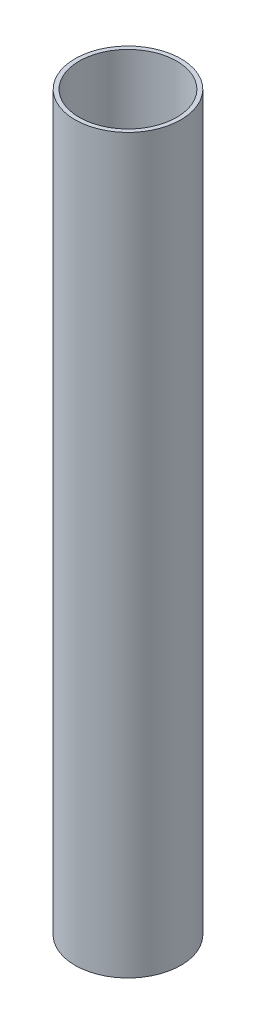
ISO-10303-21;
HEADER;
FILE_DESCRIPTION(('STEP AP214'),'2;1');
FILE_NAME('part.step','',(''),(''),'','','');
FILE_SCHEMA(('AUTOMOTIVE_DESIGN { 1 0 10303 214 1 1 1 1 }'));
ENDSEC;
DATA;
#1=APPLICATION_CONTEXT('core data for automotive mechanical design processes');
#2=APPLICATION_PROTOCOL_DEFINITION('international standard','automotive_design',2000,#1);
#3=PRODUCT_CONTEXT('',#1,'mechanical');
#4=PRODUCT('Part','Part','',(#3));
#5=PRODUCT_RELATED_PRODUCT_CATEGORY('part','',(#4));
#6=PRODUCT_DEFINITION_FORMATION('','',#4);
#7=PRODUCT_DEFINITION_CONTEXT('part definition',#1,'design');
#8=PRODUCT_DEFINITION('design','',#6,#7);
#9=PRODUCT_DEFINITION_SHAPE('','',#8);
#10=(LENGTH_UNIT() NAMED_UNIT(*) SI_UNIT(.MILLI.,.METRE.));
#11=(NAMED_UNIT(*) PLANE_ANGLE_UNIT() SI_UNIT($,.RADIAN.));
#12=(NAMED_UNIT(*) SI_UNIT($,.STERADIAN.) SOLID_ANGLE_UNIT());
#13=UNCERTAINTY_MEASURE_WITH_UNIT(LENGTH_MEASURE(1.E-05),#10,'distance_accuracy_value','');
#14=(GEOMETRIC_REPRESENTATION_CONTEXT(3) GLOBAL_UNCERTAINTY_ASSIGNED_CONTEXT((#13)) GLOBAL_UNIT_ASSIGNED_CONTEXT((#10,
#11,#12)) REPRESENTATION_CONTEXT('',''));
#15=CARTESIAN_POINT('',(0.,0.,0.));
#16=DIRECTION('',(0.,0.,1.));
#17=DIRECTION('',(1.,0.,0.));
#18=AXIS2_PLACEMENT_3D('',#15,#16,#17);
#19=CARTESIAN_POINT('',(0.,220.,0.));
#20=DIRECTION('',(0.,1.,0.));
#21=DIRECTION('',(0.,0.,1.));
#22=AXIS2_PLACEMENT_3D('',#19,#20,#21);
#23=PLANE('',#22);
#24=CARTESIAN_POINT('',(0.,220.,0.));
#25=DIRECTION('',(0.,1.,0.));
#26=DIRECTION('',(0.,0.,1.));
#27=AXIS2_PLACEMENT_3D('',#24,#25,#26);
#28=CIRCLE('',#27,15.9);
#29=CARTESIAN_POINT('',(0.,220.,15.9));
#30=VERTEX_POINT('',#29);
#31=EDGE_CURVE('E10',#30,#30,#28,.T.);
#32=ORIENTED_EDGE('',*,*,#31,.T.);
#33=EDGE_LOOP('',(#32));
#34=FACE_BOUND('',#33,.T.);
#35=CARTESIAN_POINT('',(0.,220.,0.));
#36=DIRECTION('',(0.,1.,0.));
#37=DIRECTION('',(0.,0.,1.));
#38=AXIS2_PLACEMENT_3D('',#35,#36,#37);
#39=CIRCLE('',#38,14.65);
#40=CARTESIAN_POINT('',(0.,220.,14.65));
#41=VERTEX_POINT('',#40);
#42=EDGE_CURVE('E43',#41,#41,#39,.T.);
#43=ORIENTED_EDGE('',*,*,#42,.F.);
#44=EDGE_LOOP('',(#43));
#45=FACE_BOUND('',#44,.T.);
#46=ADVANCED_FACE('F32',(#34,#45),#23,.T.);
#47=CARTESIAN_POINT('',(0.,0.,0.));
#48=DIRECTION('',(0.,1.,0.));
#49=DIRECTION('',(0.,0.,1.));
#50=AXIS2_PLACEMENT_3D('',#47,#48,#49);
#51=PLANE('',#50);
#52=CARTESIAN_POINT('',(0.,0.,0.));
#53=DIRECTION('',(0.,1.,0.));
#54=DIRECTION('',(0.,0.,1.));
#55=AXIS2_PLACEMENT_3D('',#52,#53,#54);
#56=CIRCLE('',#55,15.9);
#57=CARTESIAN_POINT('',(0.,0.,15.9));
#58=VERTEX_POINT('',#57);
#59=EDGE_CURVE('E36',#58,#58,#56,.T.);
#60=ORIENTED_EDGE('',*,*,#59,.F.);
#61=EDGE_LOOP('',(#60));
#62=FACE_BOUND('',#61,.T.);
#63=CARTESIAN_POINT('',(0.,0.,0.));
#64=DIRECTION('',(0.,1.,0.));
#65=DIRECTION('',(0.,0.,1.));
#66=AXIS2_PLACEMENT_3D('',#63,#64,#65);
#67=CIRCLE('',#66,14.65);
#68=CARTESIAN_POINT('',(0.,0.,14.65));
#69=VERTEX_POINT('',#68);
#70=EDGE_CURVE('E45',#69,#69,#67,.T.);
#71=ORIENTED_EDGE('',*,*,#70,.T.);
#72=EDGE_LOOP('',(#71));
#73=FACE_BOUND('',#72,.T.);
#74=ADVANCED_FACE('F55',(#62,#73),#51,.F.);
#75=CARTESIAN_POINT('',(0.,220.,0.));
#76=DIRECTION('',(0.,-1.,0.));
#77=DIRECTION('',(0.,0.,-1.));
#78=AXIS2_PLACEMENT_3D('',#75,#76,#77);
#79=CYLINDRICAL_SURFACE('',#78,15.9);
#80=ORIENTED_EDGE('',*,*,#31,.F.);
#81=EDGE_LOOP('',(#80));
#82=FACE_BOUND('',#81,.T.);
#83=ORIENTED_EDGE('',*,*,#59,.T.);
#84=EDGE_LOOP('',(#83));
#85=FACE_BOUND('',#84,.T.);
#86=ADVANCED_FACE('F34',(#82,#85),#79,.T.);
#87=CARTESIAN_POINT('',(0.,220.,0.));
#88=DIRECTION('',(0.,-1.,0.));
#89=DIRECTION('',(0.,0.,-1.));
#90=AXIS2_PLACEMENT_3D('',#87,#88,#89);
#91=CYLINDRICAL_SURFACE('',#90,14.65);
#92=ORIENTED_EDGE('',*,*,#42,.T.);
#93=EDGE_LOOP('',(#92));
#94=FACE_BOUND('',#93,.T.);
#95=ORIENTED_EDGE('',*,*,#70,.F.);
#96=EDGE_LOOP('',(#95));
#97=FACE_BOUND('',#96,.T.);
#98=ADVANCED_FACE('F51',(#94,#97),#91,.F.);
#99=CLOSED_SHELL('',(#46,#74,#86,#98));
#100=MANIFOLD_SOLID_BREP('B2',#99);
#101=ADVANCED_BREP_SHAPE_REPRESENTATION('',(#18,#100),#14);
#102=SHAPE_DEFINITION_REPRESENTATION(#9,#101);
ENDSEC;
END-ISO-10303-21;
